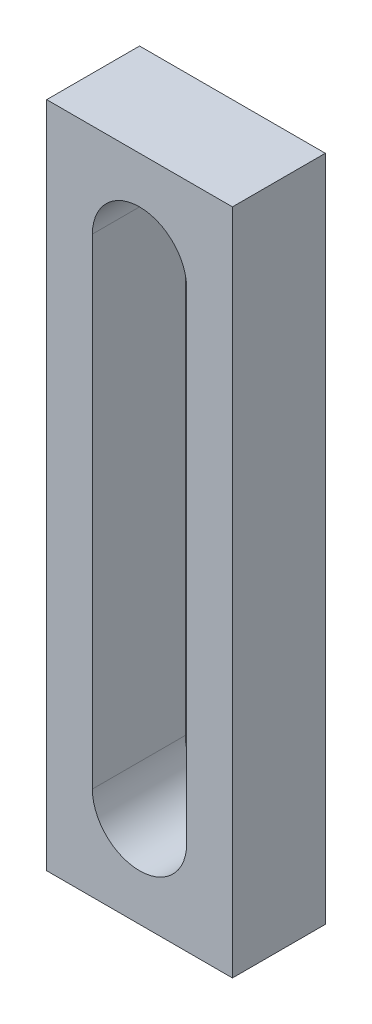
ISO-10303-21;
HEADER;
FILE_DESCRIPTION(('STEP AP214'),'2;1');
FILE_NAME('part.step','',(''),(''),'','','');
FILE_SCHEMA(('AUTOMOTIVE_DESIGN { 1 0 10303 214 1 1 1 1 }'));
ENDSEC;
DATA;
#1=APPLICATION_CONTEXT('core data for automotive mechanical design processes');
#2=APPLICATION_PROTOCOL_DEFINITION('international standard','automotive_design',2000,#1);
#3=PRODUCT_CONTEXT('',#1,'mechanical');
#4=PRODUCT('Part','Part','',(#3));
#5=PRODUCT_RELATED_PRODUCT_CATEGORY('part','',(#4));
#6=PRODUCT_DEFINITION_FORMATION('','',#4);
#7=PRODUCT_DEFINITION_CONTEXT('part definition',#1,'design');
#8=PRODUCT_DEFINITION('design','',#6,#7);
#9=PRODUCT_DEFINITION_SHAPE('','',#8);
#10=(LENGTH_UNIT() NAMED_UNIT(*) SI_UNIT(.MILLI.,.METRE.));
#11=(NAMED_UNIT(*) PLANE_ANGLE_UNIT() SI_UNIT($,.RADIAN.));
#12=(NAMED_UNIT(*) SI_UNIT($,.STERADIAN.) SOLID_ANGLE_UNIT());
#13=UNCERTAINTY_MEASURE_WITH_UNIT(LENGTH_MEASURE(1.E-05),#10,'distance_accuracy_value','');
#14=(GEOMETRIC_REPRESENTATION_CONTEXT(3) GLOBAL_UNCERTAINTY_ASSIGNED_CONTEXT((#13)) GLOBAL_UNIT_ASSIGNED_CONTEXT((#10,
#11,#12)) REPRESENTATION_CONTEXT('',''));
#15=CARTESIAN_POINT('',(0.,0.,0.));
#16=DIRECTION('',(0.,0.,1.));
#17=DIRECTION('',(1.,0.,0.));
#18=AXIS2_PLACEMENT_3D('',#15,#16,#17);
#19=CARTESIAN_POINT('',(50.8,-91.314999971,25.4));
#20=DIRECTION('',(-1.,0.,0.));
#21=DIRECTION('',(0.,0.,1.));
#22=AXIS2_PLACEMENT_3D('',#19,#20,#21);
#23=PLANE('',#22);
#24=DIRECTION('',(0.,1.,0.));
#25=VECTOR('',#24,1.);
#26=CARTESIAN_POINT('',(50.8,-91.314999971,0.));
#27=LINE('',#26,#25);
#28=CARTESIAN_POINT('',(50.8,-91.314999971,0.));
#29=VERTEX_POINT('',#28);
#30=CARTESIAN_POINT('',(50.8,91.314999971,0.));
#31=VERTEX_POINT('',#30);
#32=EDGE_CURVE('E151',#29,#31,#27,.T.);
#33=ORIENTED_EDGE('',*,*,#32,.T.);
#34=DIRECTION('',(0.,0.,-1.));
#35=VECTOR('',#34,1.);
#36=CARTESIAN_POINT('',(50.8,91.314999971,25.4));
#37=LINE('',#36,#35);
#38=CARTESIAN_POINT('',(50.8,91.314999971,25.4));
#39=VERTEX_POINT('',#38);
#40=EDGE_CURVE('E11',#39,#31,#37,.T.);
#41=ORIENTED_EDGE('',*,*,#40,.F.);
#42=DIRECTION('',(0.,1.,0.));
#43=VECTOR('',#42,1.);
#44=CARTESIAN_POINT('',(50.8,-91.314999971,25.4));
#45=LINE('',#44,#43);
#46=CARTESIAN_POINT('',(50.8,-91.314999971,25.4));
#47=VERTEX_POINT('',#46);
#48=EDGE_CURVE('E160',#47,#39,#45,.T.);
#49=ORIENTED_EDGE('',*,*,#48,.F.);
#50=DIRECTION('',(0.,0.,-1.));
#51=VECTOR('',#50,1.);
#52=CARTESIAN_POINT('',(50.8,-91.314999971,25.4));
#53=LINE('',#52,#51);
#54=EDGE_CURVE('E141',#47,#29,#53,.T.);
#55=ORIENTED_EDGE('',*,*,#54,.T.);
#56=EDGE_LOOP('',(#33,#41,#49,#55));
#57=FACE_BOUND('',#56,.T.);
#58=ADVANCED_FACE('F45',(#57),#23,.F.);
#59=CARTESIAN_POINT('',(50.8,91.314999971,25.4));
#60=DIRECTION('',(0.,-1.,0.));
#61=DIRECTION('',(1.,0.,0.));
#62=AXIS2_PLACEMENT_3D('',#59,#60,#61);
#63=PLANE('',#62);
#64=DIRECTION('',(-1.,0.,0.));
#65=VECTOR('',#64,1.);
#66=CARTESIAN_POINT('',(50.8,91.314999971,0.));
#67=LINE('',#66,#65);
#68=CARTESIAN_POINT('',(0.,91.314999971,0.));
#69=VERTEX_POINT('',#68);
#70=EDGE_CURVE('E101',#31,#69,#67,.T.);
#71=ORIENTED_EDGE('',*,*,#70,.T.);
#72=DIRECTION('',(0.,0.,-1.));
#73=VECTOR('',#72,1.);
#74=CARTESIAN_POINT('',(0.,91.314999971,25.4));
#75=LINE('',#74,#73);
#76=CARTESIAN_POINT('',(0.,91.314999971,25.4));
#77=VERTEX_POINT('',#76);
#78=EDGE_CURVE('E54',#77,#69,#75,.T.);
#79=ORIENTED_EDGE('',*,*,#78,.F.);
#80=DIRECTION('',(-1.,0.,0.));
#81=VECTOR('',#80,1.);
#82=CARTESIAN_POINT('',(50.8,91.314999971,25.4));
#83=LINE('',#82,#81);
#84=EDGE_CURVE('E124',#39,#77,#83,.T.);
#85=ORIENTED_EDGE('',*,*,#84,.F.);
#86=ORIENTED_EDGE('',*,*,#40,.T.);
#87=EDGE_LOOP('',(#71,#79,#85,#86));
#88=FACE_BOUND('',#87,.T.);
#89=ADVANCED_FACE('F198',(#88),#63,.F.);
#90=CARTESIAN_POINT('',(0.,91.314999971,25.4));
#91=DIRECTION('',(1.,0.,0.));
#92=DIRECTION('',(0.,0.,-1.));
#93=AXIS2_PLACEMENT_3D('',#90,#91,#92);
#94=PLANE('',#93);
#95=DIRECTION('',(0.,-1.,0.));
#96=VECTOR('',#95,1.);
#97=CARTESIAN_POINT('',(0.,91.314999971,0.));
#98=LINE('',#97,#96);
#99=CARTESIAN_POINT('',(0.,-91.314999971,0.));
#100=VERTEX_POINT('',#99);
#101=EDGE_CURVE('E109',#69,#100,#98,.T.);
#102=ORIENTED_EDGE('',*,*,#101,.T.);
#103=DIRECTION('',(0.,0.,-1.));
#104=VECTOR('',#103,1.);
#105=CARTESIAN_POINT('',(0.,-91.314999971,25.4));
#106=LINE('',#105,#104);
#107=CARTESIAN_POINT('',(0.,-91.314999971,25.4));
#108=VERTEX_POINT('',#107);
#109=EDGE_CURVE('E138',#108,#100,#106,.T.);
#110=ORIENTED_EDGE('',*,*,#109,.F.);
#111=DIRECTION('',(0.,-1.,0.));
#112=VECTOR('',#111,1.);
#113=CARTESIAN_POINT('',(0.,91.314999971,25.4));
#114=LINE('',#113,#112);
#115=EDGE_CURVE('E132',#77,#108,#114,.T.);
#116=ORIENTED_EDGE('',*,*,#115,.F.);
#117=ORIENTED_EDGE('',*,*,#78,.T.);
#118=EDGE_LOOP('',(#102,#110,#116,#117));
#119=FACE_BOUND('',#118,.T.);
#120=ADVANCED_FACE('F139',(#119),#94,.F.);
#121=CARTESIAN_POINT('',(0.,-91.314999971,25.4));
#122=DIRECTION('',(0.,1.,0.));
#123=DIRECTION('',(-1.,0.,0.));
#124=AXIS2_PLACEMENT_3D('',#121,#122,#123);
#125=PLANE('',#124);
#126=DIRECTION('',(1.,0.,0.));
#127=VECTOR('',#126,1.);
#128=CARTESIAN_POINT('',(0.,-91.314999971,0.));
#129=LINE('',#128,#127);
#130=EDGE_CURVE('E116',#100,#29,#129,.T.);
#131=ORIENTED_EDGE('',*,*,#130,.T.);
#132=ORIENTED_EDGE('',*,*,#54,.F.);
#133=DIRECTION('',(1.,0.,0.));
#134=VECTOR('',#133,1.);
#135=CARTESIAN_POINT('',(0.,-91.314999971,25.4));
#136=LINE('',#135,#134);
#137=EDGE_CURVE('E135',#108,#47,#136,.T.);
#138=ORIENTED_EDGE('',*,*,#137,.F.);
#139=ORIENTED_EDGE('',*,*,#109,.T.);
#140=EDGE_LOOP('',(#131,#132,#138,#139));
#141=FACE_BOUND('',#140,.T.);
#142=ADVANCED_FACE('F143',(#141),#125,.F.);
#143=CARTESIAN_POINT('',(0.,0.,25.4));
#144=DIRECTION('',(0.,0.,1.));
#145=DIRECTION('',(1.,0.,0.));
#146=AXIS2_PLACEMENT_3D('',#143,#144,#145);
#147=PLANE('',#146);
#148=CARTESIAN_POINT('',(25.4,65.714999971,25.4));
#149=DIRECTION('',(0.,0.,1.));
#150=DIRECTION('',(1.,0.,0.));
#151=AXIS2_PLACEMENT_3D('',#148,#149,#150);
#152=CIRCLE('',#151,12.9);
#153=CARTESIAN_POINT('',(38.3,65.714999971,25.4));
#154=VERTEX_POINT('',#153);
#155=CARTESIAN_POINT('',(12.5,65.714999971,25.4));
#156=VERTEX_POINT('',#155);
#157=EDGE_CURVE('E48',#154,#156,#152,.T.);
#158=ORIENTED_EDGE('',*,*,#157,.F.);
#159=DIRECTION('',(0.,1.,0.));
#160=VECTOR('',#159,1.);
#161=CARTESIAN_POINT('',(38.3,0.,25.4));
#162=LINE('',#161,#160);
#163=CARTESIAN_POINT('',(38.3,-65.714999971,25.4));
#164=VERTEX_POINT('',#163);
#165=EDGE_CURVE('E92',#154,#164,#162,.F.);
#166=ORIENTED_EDGE('',*,*,#165,.T.);
#167=CARTESIAN_POINT('',(25.4,-65.714999971,25.4));
#168=DIRECTION('',(0.,0.,1.));
#169=DIRECTION('',(1.,0.,0.));
#170=AXIS2_PLACEMENT_3D('',#167,#168,#169);
#171=CIRCLE('',#170,12.9);
#172=CARTESIAN_POINT('',(12.5,-65.714999971,25.4));
#173=VERTEX_POINT('',#172);
#174=EDGE_CURVE('E167',#173,#164,#171,.T.);
#175=ORIENTED_EDGE('',*,*,#174,.F.);
#176=DIRECTION('',(0.,1.,0.));
#177=VECTOR('',#176,1.);
#178=CARTESIAN_POINT('',(12.5,65.714999971,25.4));
#179=LINE('',#178,#177);
#180=EDGE_CURVE('E164',#156,#173,#179,.F.);
#181=ORIENTED_EDGE('',*,*,#180,.F.);
#182=EDGE_LOOP('',(#158,#166,#175,#181));
#183=FACE_BOUND('',#182,.T.);
#184=ORIENTED_EDGE('',*,*,#48,.T.);
#185=ORIENTED_EDGE('',*,*,#84,.T.);
#186=ORIENTED_EDGE('',*,*,#115,.T.);
#187=ORIENTED_EDGE('',*,*,#137,.T.);
#188=EDGE_LOOP('',(#184,#185,#186,#187));
#189=FACE_BOUND('',#188,.T.);
#190=ADVANCED_FACE('F133',(#183,#189),#147,.T.);
#191=CARTESIAN_POINT('',(0.,0.,0.));
#192=DIRECTION('',(0.,0.,1.));
#193=DIRECTION('',(1.,0.,0.));
#194=AXIS2_PLACEMENT_3D('',#191,#192,#193);
#195=PLANE('',#194);
#196=DIRECTION('',(0.,-1.,0.));
#197=VECTOR('',#196,1.);
#198=CARTESIAN_POINT('',(38.3,65.714999971,0.));
#199=LINE('',#198,#197);
#200=CARTESIAN_POINT('',(38.3,65.714999971,0.));
#201=VERTEX_POINT('',#200);
#202=CARTESIAN_POINT('',(38.3,-65.714999971,0.));
#203=VERTEX_POINT('',#202);
#204=EDGE_CURVE('E190',#201,#203,#199,.T.);
#205=ORIENTED_EDGE('',*,*,#204,.F.);
#206=CARTESIAN_POINT('',(25.4,65.714999971,0.));
#207=DIRECTION('',(0.,0.,1.));
#208=DIRECTION('',(1.,0.,0.));
#209=AXIS2_PLACEMENT_3D('',#206,#207,#208);
#210=CIRCLE('',#209,12.9);
#211=CARTESIAN_POINT('',(12.5,65.714999971,0.));
#212=VERTEX_POINT('',#211);
#213=EDGE_CURVE('E272',#201,#212,#210,.T.);
#214=ORIENTED_EDGE('',*,*,#213,.T.);
#215=DIRECTION('',(0.,-1.,0.));
#216=VECTOR('',#215,1.);
#217=CARTESIAN_POINT('',(12.5,65.714999971,0.));
#218=LINE('',#217,#216);
#219=CARTESIAN_POINT('',(12.5,-65.714999971,0.));
#220=VERTEX_POINT('',#219);
#221=EDGE_CURVE('E274',#212,#220,#218,.T.);
#222=ORIENTED_EDGE('',*,*,#221,.T.);
#223=CARTESIAN_POINT('',(25.4,-65.714999971,0.));
#224=DIRECTION('',(0.,0.,1.));
#225=DIRECTION('',(1.,0.,0.));
#226=AXIS2_PLACEMENT_3D('',#223,#224,#225);
#227=CIRCLE('',#226,12.9);
#228=EDGE_CURVE('E71',#220,#203,#227,.T.);
#229=ORIENTED_EDGE('',*,*,#228,.T.);
#230=EDGE_LOOP('',(#205,#214,#222,#229));
#231=FACE_BOUND('',#230,.T.);
#232=ORIENTED_EDGE('',*,*,#32,.F.);
#233=ORIENTED_EDGE('',*,*,#130,.F.);
#234=ORIENTED_EDGE('',*,*,#101,.F.);
#235=ORIENTED_EDGE('',*,*,#70,.F.);
#236=EDGE_LOOP('',(#232,#233,#234,#235));
#237=FACE_BOUND('',#236,.T.);
#238=ADVANCED_FACE('F199',(#231,#237),#195,.F.);
#239=CARTESIAN_POINT('',(25.4,65.714999971,0.));
#240=DIRECTION('',(0.,0.,1.));
#241=DIRECTION('',(1.,0.,0.));
#242=AXIS2_PLACEMENT_3D('',#239,#240,#241);
#243=CYLINDRICAL_SURFACE('',#242,12.9);
#244=ORIENTED_EDGE('',*,*,#157,.T.);
#245=DIRECTION('',(0.,0.,1.));
#246=VECTOR('',#245,1.);
#247=CARTESIAN_POINT('',(12.5,65.714999971,0.));
#248=LINE('',#247,#246);
#249=EDGE_CURVE('E62',#212,#156,#248,.T.);
#250=ORIENTED_EDGE('',*,*,#249,.F.);
#251=ORIENTED_EDGE('',*,*,#213,.F.);
#252=DIRECTION('',(0.,0.,1.));
#253=VECTOR('',#252,1.);
#254=CARTESIAN_POINT('',(38.3,65.714999971,0.));
#255=LINE('',#254,#253);
#256=EDGE_CURVE('E168',#201,#154,#255,.T.);
#257=ORIENTED_EDGE('',*,*,#256,.T.);
#258=EDGE_LOOP('',(#244,#250,#251,#257));
#259=FACE_BOUND('',#258,.T.);
#260=ADVANCED_FACE('F177',(#259),#243,.F.);
#261=CARTESIAN_POINT('',(38.3,65.714999971,0.));
#262=DIRECTION('',(-1.,0.,0.));
#263=DIRECTION('',(0.,0.,1.));
#264=AXIS2_PLACEMENT_3D('',#261,#262,#263);
#265=PLANE('',#264);
#266=ORIENTED_EDGE('',*,*,#256,.F.);
#267=ORIENTED_EDGE('',*,*,#204,.T.);
#268=DIRECTION('',(0.,0.,1.));
#269=VECTOR('',#268,1.);
#270=CARTESIAN_POINT('',(38.3,-65.714999971,0.));
#271=LINE('',#270,#269);
#272=EDGE_CURVE('E185',#203,#164,#271,.T.);
#273=ORIENTED_EDGE('',*,*,#272,.T.);
#274=ORIENTED_EDGE('',*,*,#165,.F.);
#275=EDGE_LOOP('',(#266,#267,#273,#274));
#276=FACE_BOUND('',#275,.T.);
#277=ADVANCED_FACE('F207',(#276),#265,.T.);
#278=CARTESIAN_POINT('',(25.4,-65.714999971,0.));
#279=DIRECTION('',(0.,0.,1.));
#280=DIRECTION('',(1.,0.,0.));
#281=AXIS2_PLACEMENT_3D('',#278,#279,#280);
#282=CYLINDRICAL_SURFACE('',#281,12.9);
#283=ORIENTED_EDGE('',*,*,#174,.T.);
#284=ORIENTED_EDGE('',*,*,#272,.F.);
#285=ORIENTED_EDGE('',*,*,#228,.F.);
#286=DIRECTION('',(0.,0.,1.));
#287=VECTOR('',#286,1.);
#288=CARTESIAN_POINT('',(12.5,-65.714999971,0.));
#289=LINE('',#288,#287);
#290=EDGE_CURVE('E181',#220,#173,#289,.T.);
#291=ORIENTED_EDGE('',*,*,#290,.T.);
#292=EDGE_LOOP('',(#283,#284,#285,#291));
#293=FACE_BOUND('',#292,.T.);
#294=ADVANCED_FACE('F183',(#293),#282,.F.);
#295=CARTESIAN_POINT('',(12.5,65.714999971,0.));
#296=DIRECTION('',(-1.,0.,0.));
#297=DIRECTION('',(0.,0.,1.));
#298=AXIS2_PLACEMENT_3D('',#295,#296,#297);
#299=PLANE('',#298);
#300=ORIENTED_EDGE('',*,*,#180,.T.);
#301=ORIENTED_EDGE('',*,*,#290,.F.);
#302=ORIENTED_EDGE('',*,*,#221,.F.);
#303=ORIENTED_EDGE('',*,*,#249,.T.);
#304=EDGE_LOOP('',(#300,#301,#302,#303));
#305=FACE_BOUND('',#304,.T.);
#306=ADVANCED_FACE('F180',(#305),#299,.F.);
#307=CLOSED_SHELL('',(#58,#89,#120,#142,#190,#238,#260,#277,#294,#306));
#308=MANIFOLD_SOLID_BREP('B2',#307);
#309=ADVANCED_BREP_SHAPE_REPRESENTATION('',(#18,#308),#14);
#310=SHAPE_DEFINITION_REPRESENTATION(#9,#309);
ENDSEC;
END-ISO-10303-21;
